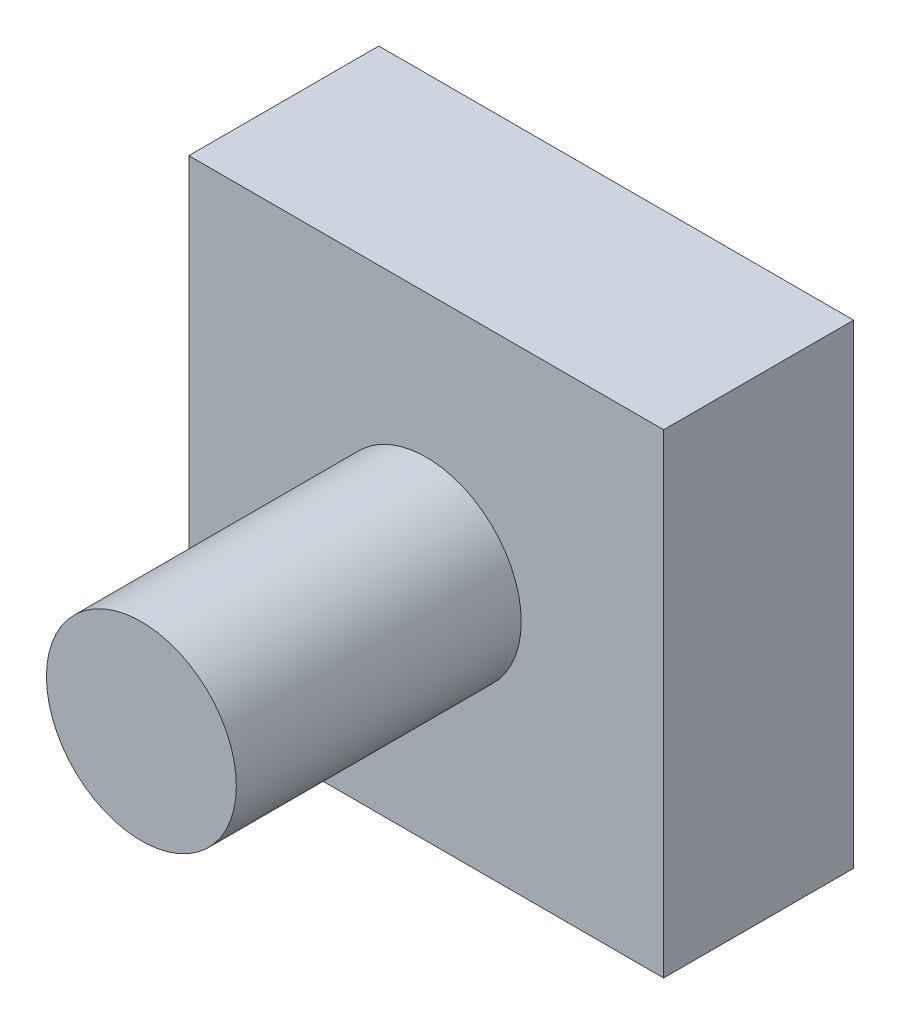
ISO-10303-21;
HEADER;
FILE_DESCRIPTION(('STEP AP214'),'2;1');
FILE_NAME('part.step','',(''),(''),'','','');
FILE_SCHEMA(('AUTOMOTIVE_DESIGN { 1 0 10303 214 1 1 1 1 }'));
ENDSEC;
DATA;
#1=APPLICATION_CONTEXT('core data for automotive mechanical design processes');
#2=APPLICATION_PROTOCOL_DEFINITION('international standard','automotive_design',2000,#1);
#3=PRODUCT_CONTEXT('',#1,'mechanical');
#4=PRODUCT('Part','Part','',(#3));
#5=PRODUCT_RELATED_PRODUCT_CATEGORY('part','',(#4));
#6=PRODUCT_DEFINITION_FORMATION('','',#4);
#7=PRODUCT_DEFINITION_CONTEXT('part definition',#1,'design');
#8=PRODUCT_DEFINITION('design','',#6,#7);
#9=PRODUCT_DEFINITION_SHAPE('','',#8);
#10=(LENGTH_UNIT() NAMED_UNIT(*) SI_UNIT(.MILLI.,.METRE.));
#11=(NAMED_UNIT(*) PLANE_ANGLE_UNIT() SI_UNIT($,.RADIAN.));
#12=(NAMED_UNIT(*) SI_UNIT($,.STERADIAN.) SOLID_ANGLE_UNIT());
#13=UNCERTAINTY_MEASURE_WITH_UNIT(LENGTH_MEASURE(1.E-05),#10,'distance_accuracy_value','');
#14=(GEOMETRIC_REPRESENTATION_CONTEXT(3) GLOBAL_UNCERTAINTY_ASSIGNED_CONTEXT((#13)) GLOBAL_UNIT_ASSIGNED_CONTEXT((#10,
#11,#12)) REPRESENTATION_CONTEXT('',''));
#15=CARTESIAN_POINT('',(0.,0.,0.));
#16=DIRECTION('',(0.,0.,1.));
#17=DIRECTION('',(1.,0.,0.));
#18=AXIS2_PLACEMENT_3D('',#15,#16,#17);
#19=CARTESIAN_POINT('',(0.,0.,0.));
#20=DIRECTION('',(0.,0.,1.));
#21=DIRECTION('',(1.,0.,0.));
#22=AXIS2_PLACEMENT_3D('',#19,#20,#21);
#23=PLANE('',#22);
#24=DIRECTION('',(0.,1.,0.));
#25=VECTOR('',#24,1.);
#26=CARTESIAN_POINT('',(25.,25.,0.));
#27=LINE('',#26,#25);
#28=CARTESIAN_POINT('',(25.,-25.,0.));
#29=VERTEX_POINT('',#28);
#30=CARTESIAN_POINT('',(25.,25.,0.));
#31=VERTEX_POINT('',#30);
#32=EDGE_CURVE('E99',#29,#31,#27,.T.);
#33=ORIENTED_EDGE('',*,*,#32,.T.);
#34=DIRECTION('',(-1.,0.,0.));
#35=VECTOR('',#34,1.);
#36=CARTESIAN_POINT('',(-25.,25.,0.));
#37=LINE('',#36,#35);
#38=CARTESIAN_POINT('',(-25.,25.,0.));
#39=VERTEX_POINT('',#38);
#40=EDGE_CURVE('E102',#31,#39,#37,.T.);
#41=ORIENTED_EDGE('',*,*,#40,.T.);
#42=DIRECTION('',(0.,-1.,0.));
#43=VECTOR('',#42,1.);
#44=CARTESIAN_POINT('',(-25.,25.,0.));
#45=LINE('',#44,#43);
#46=CARTESIAN_POINT('',(-25.,-25.,0.));
#47=VERTEX_POINT('',#46);
#48=EDGE_CURVE('E84',#39,#47,#45,.T.);
#49=ORIENTED_EDGE('',*,*,#48,.T.);
#50=DIRECTION('',(1.,0.,0.));
#51=VECTOR('',#50,1.);
#52=CARTESIAN_POINT('',(-25.,-25.,0.));
#53=LINE('',#52,#51);
#54=EDGE_CURVE('E94',#47,#29,#53,.T.);
#55=ORIENTED_EDGE('',*,*,#54,.T.);
#56=EDGE_LOOP('',(#33,#41,#49,#55));
#57=FACE_BOUND('',#56,.T.);
#58=CARTESIAN_POINT('',(0.,0.,0.));
#59=DIRECTION('',(0.,0.,1.));
#60=DIRECTION('',(1.,0.,0.));
#61=AXIS2_PLACEMENT_3D('',#58,#59,#60);
#62=CIRCLE('',#61,10.);
#63=CARTESIAN_POINT('',(10.,0.,0.));
#64=VERTEX_POINT('',#63);
#65=EDGE_CURVE('E136',#64,#64,#62,.T.);
#66=ORIENTED_EDGE('',*,*,#65,.F.);
#67=EDGE_LOOP('',(#66));
#68=FACE_BOUND('',#67,.T.);
#69=ADVANCED_FACE('F33',(#57,#68),#23,.T.);
#70=CARTESIAN_POINT('',(25.,25.,-20.));
#71=DIRECTION('',(1.,0.,0.));
#72=DIRECTION('',(0.,1.,0.));
#73=AXIS2_PLACEMENT_3D('',#70,#71,#72);
#74=PLANE('',#73);
#75=ORIENTED_EDGE('',*,*,#32,.F.);
#76=DIRECTION('',(0.,0.,1.));
#77=VECTOR('',#76,1.);
#78=CARTESIAN_POINT('',(25.,-25.,-20.));
#79=LINE('',#78,#77);
#80=CARTESIAN_POINT('',(25.,-25.,-20.));
#81=VERTEX_POINT('',#80);
#82=EDGE_CURVE('E11',#81,#29,#79,.T.);
#83=ORIENTED_EDGE('',*,*,#82,.F.);
#84=DIRECTION('',(0.,1.,0.));
#85=VECTOR('',#84,1.);
#86=CARTESIAN_POINT('',(25.,25.,-20.));
#87=LINE('',#86,#85);
#88=CARTESIAN_POINT('',(25.,25.,-20.));
#89=VERTEX_POINT('',#88);
#90=EDGE_CURVE('E92',#81,#89,#87,.T.);
#91=ORIENTED_EDGE('',*,*,#90,.T.);
#92=DIRECTION('',(0.,0.,1.));
#93=VECTOR('',#92,1.);
#94=CARTESIAN_POINT('',(25.,25.,-20.));
#95=LINE('',#94,#93);
#96=EDGE_CURVE('E37',#89,#31,#95,.T.);
#97=ORIENTED_EDGE('',*,*,#96,.T.);
#98=EDGE_LOOP('',(#75,#83,#91,#97));
#99=FACE_BOUND('',#98,.T.);
#100=ADVANCED_FACE('F35',(#99),#74,.T.);
#101=CARTESIAN_POINT('',(-25.,-25.,-20.));
#102=DIRECTION('',(0.,-1.,0.));
#103=DIRECTION('',(0.,0.,-1.));
#104=AXIS2_PLACEMENT_3D('',#101,#102,#103);
#105=PLANE('',#104);
#106=ORIENTED_EDGE('',*,*,#54,.F.);
#107=DIRECTION('',(0.,0.,1.));
#108=VECTOR('',#107,1.);
#109=CARTESIAN_POINT('',(-25.,-25.,-20.));
#110=LINE('',#109,#108);
#111=CARTESIAN_POINT('',(-25.,-25.,-20.));
#112=VERTEX_POINT('',#111);
#113=EDGE_CURVE('E43',#112,#47,#110,.T.);
#114=ORIENTED_EDGE('',*,*,#113,.F.);
#115=DIRECTION('',(1.,0.,0.));
#116=VECTOR('',#115,1.);
#117=CARTESIAN_POINT('',(-25.,-25.,-20.));
#118=LINE('',#117,#116);
#119=EDGE_CURVE('E89',#112,#81,#118,.T.);
#120=ORIENTED_EDGE('',*,*,#119,.T.);
#121=ORIENTED_EDGE('',*,*,#82,.T.);
#122=EDGE_LOOP('',(#106,#114,#120,#121));
#123=FACE_BOUND('',#122,.T.);
#124=ADVANCED_FACE('F110',(#123),#105,.T.);
#125=CARTESIAN_POINT('',(-25.,25.,-20.));
#126=DIRECTION('',(-1.,0.,0.));
#127=DIRECTION('',(0.,-1.,0.));
#128=AXIS2_PLACEMENT_3D('',#125,#126,#127);
#129=PLANE('',#128);
#130=ORIENTED_EDGE('',*,*,#48,.F.);
#131=DIRECTION('',(0.,0.,1.));
#132=VECTOR('',#131,1.);
#133=CARTESIAN_POINT('',(-25.,25.,-20.));
#134=LINE('',#133,#132);
#135=CARTESIAN_POINT('',(-25.,25.,-20.));
#136=VERTEX_POINT('',#135);
#137=EDGE_CURVE('E79',#136,#39,#134,.T.);
#138=ORIENTED_EDGE('',*,*,#137,.F.);
#139=DIRECTION('',(0.,-1.,0.));
#140=VECTOR('',#139,1.);
#141=CARTESIAN_POINT('',(-25.,25.,-20.));
#142=LINE('',#141,#140);
#143=EDGE_CURVE('E82',#136,#112,#142,.T.);
#144=ORIENTED_EDGE('',*,*,#143,.T.);
#145=ORIENTED_EDGE('',*,*,#113,.T.);
#146=EDGE_LOOP('',(#130,#138,#144,#145));
#147=FACE_BOUND('',#146,.T.);
#148=ADVANCED_FACE('F81',(#147),#129,.T.);
#149=CARTESIAN_POINT('',(-25.,25.,-20.));
#150=DIRECTION('',(0.,1.,0.));
#151=DIRECTION('',(0.,0.,1.));
#152=AXIS2_PLACEMENT_3D('',#149,#150,#151);
#153=PLANE('',#152);
#154=ORIENTED_EDGE('',*,*,#40,.F.);
#155=ORIENTED_EDGE('',*,*,#96,.F.);
#156=DIRECTION('',(-1.,0.,0.));
#157=VECTOR('',#156,1.);
#158=CARTESIAN_POINT('',(-25.,25.,-20.));
#159=LINE('',#158,#157);
#160=EDGE_CURVE('E88',#89,#136,#159,.T.);
#161=ORIENTED_EDGE('',*,*,#160,.T.);
#162=ORIENTED_EDGE('',*,*,#137,.T.);
#163=EDGE_LOOP('',(#154,#155,#161,#162));
#164=FACE_BOUND('',#163,.T.);
#165=ADVANCED_FACE('F91',(#164),#153,.T.);
#166=CARTESIAN_POINT('',(0.,0.,-20.));
#167=DIRECTION('',(0.,0.,1.));
#168=DIRECTION('',(1.,0.,0.));
#169=AXIS2_PLACEMENT_3D('',#166,#167,#168);
#170=PLANE('',#169);
#171=ORIENTED_EDGE('',*,*,#90,.F.);
#172=ORIENTED_EDGE('',*,*,#119,.F.);
#173=ORIENTED_EDGE('',*,*,#143,.F.);
#174=ORIENTED_EDGE('',*,*,#160,.F.);
#175=EDGE_LOOP('',(#171,#172,#173,#174));
#176=FACE_BOUND('',#175,.T.);
#177=ADVANCED_FACE('F87',(#176),#170,.F.);
#178=CARTESIAN_POINT('',(0.,0.,30.));
#179=DIRECTION('',(0.,0.,-1.));
#180=DIRECTION('',(-1.,0.,0.));
#181=AXIS2_PLACEMENT_3D('',#178,#179,#180);
#182=CYLINDRICAL_SURFACE('',#181,10.);
#183=CARTESIAN_POINT('',(0.,0.,30.));
#184=DIRECTION('',(0.,0.,1.));
#185=DIRECTION('',(1.,0.,0.));
#186=AXIS2_PLACEMENT_3D('',#183,#184,#185);
#187=CIRCLE('',#186,10.);
#188=CARTESIAN_POINT('',(10.,0.,30.));
#189=VERTEX_POINT('',#188);
#190=EDGE_CURVE('E103',#189,#189,#187,.T.);
#191=ORIENTED_EDGE('',*,*,#190,.F.);
#192=EDGE_LOOP('',(#191));
#193=FACE_BOUND('',#192,.T.);
#194=ORIENTED_EDGE('',*,*,#65,.T.);
#195=EDGE_LOOP('',(#194));
#196=FACE_BOUND('',#195,.T.);
#197=ADVANCED_FACE('F125',(#193,#196),#182,.T.);
#198=CARTESIAN_POINT('',(0.,0.,30.));
#199=DIRECTION('',(0.,0.,1.));
#200=DIRECTION('',(1.,0.,0.));
#201=AXIS2_PLACEMENT_3D('',#198,#199,#200);
#202=PLANE('',#201);
#203=ORIENTED_EDGE('',*,*,#190,.T.);
#204=EDGE_LOOP('',(#203));
#205=FACE_BOUND('',#204,.T.);
#206=ADVANCED_FACE('F128',(#205),#202,.T.);
#207=CLOSED_SHELL('',(#69,#100,#124,#148,#165,#177,#197,#206));
#208=MANIFOLD_SOLID_BREP('B2',#207);
#209=ADVANCED_BREP_SHAPE_REPRESENTATION('',(#18,#208),#14);
#210=SHAPE_DEFINITION_REPRESENTATION(#9,#209);
ENDSEC;
END-ISO-10303-21;
